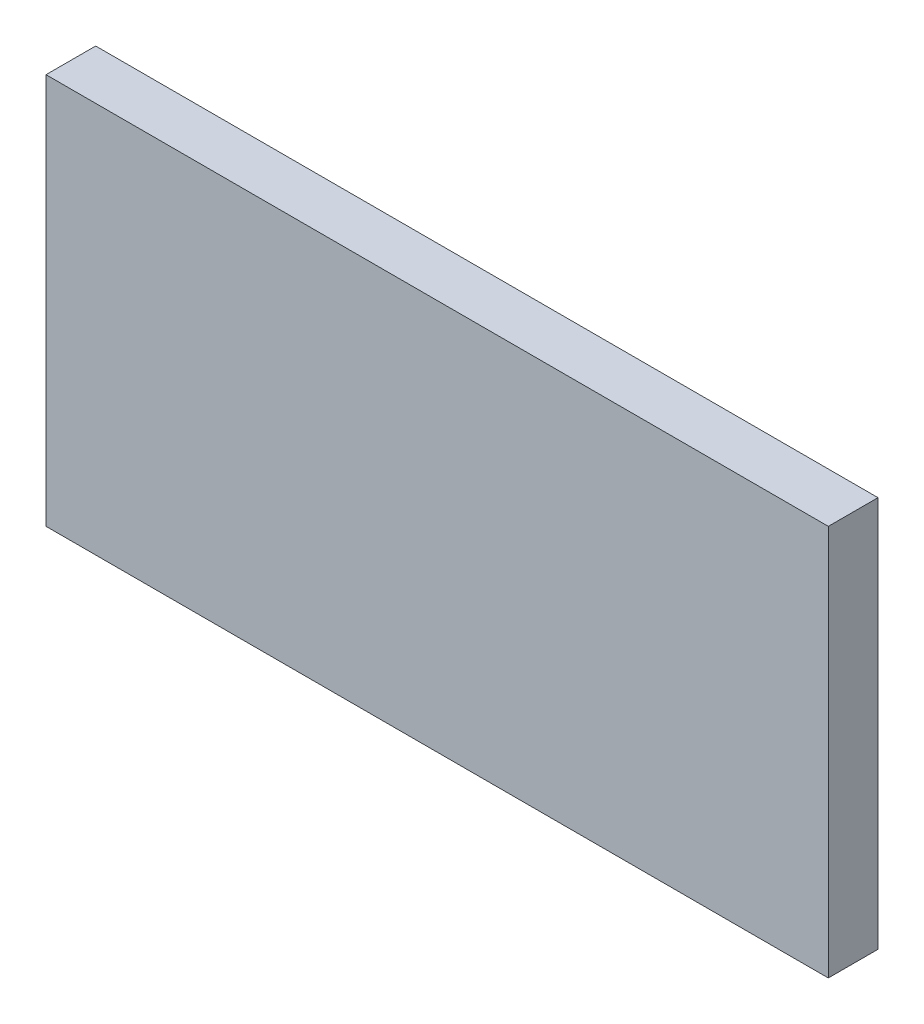
ISO-10303-21;
HEADER;
FILE_DESCRIPTION(('STEP AP214'),'2;1');
FILE_NAME('part.step','',(''),(''),'','','');
FILE_SCHEMA(('AUTOMOTIVE_DESIGN { 1 0 10303 214 1 1 1 1 }'));
ENDSEC;
DATA;
#1=APPLICATION_CONTEXT('core data for automotive mechanical design processes');
#2=APPLICATION_PROTOCOL_DEFINITION('international standard','automotive_design',2000,#1);
#3=PRODUCT_CONTEXT('',#1,'mechanical');
#4=PRODUCT('Part','Part','',(#3));
#5=PRODUCT_RELATED_PRODUCT_CATEGORY('part','',(#4));
#6=PRODUCT_DEFINITION_FORMATION('','',#4);
#7=PRODUCT_DEFINITION_CONTEXT('part definition',#1,'design');
#8=PRODUCT_DEFINITION('design','',#6,#7);
#9=PRODUCT_DEFINITION_SHAPE('','',#8);
#10=(LENGTH_UNIT() NAMED_UNIT(*) SI_UNIT(.MILLI.,.METRE.));
#11=(NAMED_UNIT(*) PLANE_ANGLE_UNIT() SI_UNIT($,.RADIAN.));
#12=(NAMED_UNIT(*) SI_UNIT($,.STERADIAN.) SOLID_ANGLE_UNIT());
#13=UNCERTAINTY_MEASURE_WITH_UNIT(LENGTH_MEASURE(1.E-05),#10,'distance_accuracy_value','');
#14=(GEOMETRIC_REPRESENTATION_CONTEXT(3) GLOBAL_UNCERTAINTY_ASSIGNED_CONTEXT((#13)) GLOBAL_UNIT_ASSIGNED_CONTEXT((#10,
#11,#12)) REPRESENTATION_CONTEXT('',''));
#15=CARTESIAN_POINT('',(0.,0.,0.));
#16=DIRECTION('',(0.,0.,1.));
#17=DIRECTION('',(1.,0.,0.));
#18=AXIS2_PLACEMENT_3D('',#15,#16,#17);
#19=CARTESIAN_POINT('',(0.,0.,3.175));
#20=DIRECTION('',(1.,0.,0.));
#21=DIRECTION('',(0.,0.,-1.));
#22=AXIS2_PLACEMENT_3D('',#19,#20,#21);
#23=PLANE('',#22);
#24=DIRECTION('',(0.,-1.,0.));
#25=VECTOR('',#24,1.);
#26=CARTESIAN_POINT('',(0.,0.,0.));
#27=LINE('',#26,#25);
#28=CARTESIAN_POINT('',(0.,25.,0.));
#29=VERTEX_POINT('',#28);
#30=CARTESIAN_POINT('',(0.,0.,0.));
#31=VERTEX_POINT('',#30);
#32=EDGE_CURVE('E96',#29,#31,#27,.T.);
#33=ORIENTED_EDGE('',*,*,#32,.T.);
#34=DIRECTION('',(0.,0.,-1.));
#35=VECTOR('',#34,1.);
#36=CARTESIAN_POINT('',(0.,0.,3.175));
#37=LINE('',#36,#35);
#38=CARTESIAN_POINT('',(0.,0.,3.175));
#39=VERTEX_POINT('',#38);
#40=EDGE_CURVE('E11',#39,#31,#37,.T.);
#41=ORIENTED_EDGE('',*,*,#40,.F.);
#42=DIRECTION('',(0.,-1.,0.));
#43=VECTOR('',#42,1.);
#44=CARTESIAN_POINT('',(0.,0.,3.175));
#45=LINE('',#44,#43);
#46=CARTESIAN_POINT('',(0.,25.,3.175));
#47=VERTEX_POINT('',#46);
#48=EDGE_CURVE('E84',#47,#39,#45,.T.);
#49=ORIENTED_EDGE('',*,*,#48,.F.);
#50=DIRECTION('',(0.,0.,-1.));
#51=VECTOR('',#50,1.);
#52=CARTESIAN_POINT('',(0.,25.,3.175));
#53=LINE('',#52,#51);
#54=EDGE_CURVE('E92',#47,#29,#53,.T.);
#55=ORIENTED_EDGE('',*,*,#54,.T.);
#56=EDGE_LOOP('',(#33,#41,#49,#55));
#57=FACE_BOUND('',#56,.T.);
#58=ADVANCED_FACE('F33',(#57),#23,.F.);
#59=CARTESIAN_POINT('',(0.,0.,3.175));
#60=DIRECTION('',(0.,1.,0.));
#61=DIRECTION('',(0.,0.,1.));
#62=AXIS2_PLACEMENT_3D('',#59,#60,#61);
#63=PLANE('',#62);
#64=DIRECTION('',(1.,0.,0.));
#65=VECTOR('',#64,1.);
#66=CARTESIAN_POINT('',(0.,0.,0.));
#67=LINE('',#66,#65);
#68=CARTESIAN_POINT('',(50.,0.,0.));
#69=VERTEX_POINT('',#68);
#70=EDGE_CURVE('E88',#31,#69,#67,.T.);
#71=ORIENTED_EDGE('',*,*,#70,.T.);
#72=DIRECTION('',(0.,0.,-1.));
#73=VECTOR('',#72,1.);
#74=CARTESIAN_POINT('',(50.,0.,3.175));
#75=LINE('',#74,#73);
#76=CARTESIAN_POINT('',(50.,0.,3.175));
#77=VERTEX_POINT('',#76);
#78=EDGE_CURVE('E41',#77,#69,#75,.T.);
#79=ORIENTED_EDGE('',*,*,#78,.F.);
#80=DIRECTION('',(1.,0.,0.));
#81=VECTOR('',#80,1.);
#82=CARTESIAN_POINT('',(0.,0.,3.175));
#83=LINE('',#82,#81);
#84=EDGE_CURVE('E79',#39,#77,#83,.T.);
#85=ORIENTED_EDGE('',*,*,#84,.F.);
#86=ORIENTED_EDGE('',*,*,#40,.T.);
#87=EDGE_LOOP('',(#71,#79,#85,#86));
#88=FACE_BOUND('',#87,.T.);
#89=ADVANCED_FACE('F87',(#88),#63,.F.);
#90=CARTESIAN_POINT('',(50.,0.,3.175));
#91=DIRECTION('',(-1.,0.,0.));
#92=DIRECTION('',(0.,0.,1.));
#93=AXIS2_PLACEMENT_3D('',#90,#91,#92);
#94=PLANE('',#93);
#95=DIRECTION('',(0.,1.,0.));
#96=VECTOR('',#95,1.);
#97=CARTESIAN_POINT('',(50.,0.,0.));
#98=LINE('',#97,#96);
#99=CARTESIAN_POINT('',(50.,25.,0.));
#100=VERTEX_POINT('',#99);
#101=EDGE_CURVE('E66',#69,#100,#98,.T.);
#102=ORIENTED_EDGE('',*,*,#101,.T.);
#103=DIRECTION('',(0.,0.,-1.));
#104=VECTOR('',#103,1.);
#105=CARTESIAN_POINT('',(50.,25.,3.175));
#106=LINE('',#105,#104);
#107=CARTESIAN_POINT('',(50.,25.,3.175));
#108=VERTEX_POINT('',#107);
#109=EDGE_CURVE('E89',#108,#100,#106,.T.);
#110=ORIENTED_EDGE('',*,*,#109,.F.);
#111=DIRECTION('',(0.,1.,0.));
#112=VECTOR('',#111,1.);
#113=CARTESIAN_POINT('',(50.,0.,3.175));
#114=LINE('',#113,#112);
#115=EDGE_CURVE('E82',#77,#108,#114,.T.);
#116=ORIENTED_EDGE('',*,*,#115,.F.);
#117=ORIENTED_EDGE('',*,*,#78,.T.);
#118=EDGE_LOOP('',(#102,#110,#116,#117));
#119=FACE_BOUND('',#118,.T.);
#120=ADVANCED_FACE('F90',(#119),#94,.F.);
#121=CARTESIAN_POINT('',(0.,25.,3.175));
#122=DIRECTION('',(0.,-1.,0.));
#123=DIRECTION('',(0.,0.,-1.));
#124=AXIS2_PLACEMENT_3D('',#121,#122,#123);
#125=PLANE('',#124);
#126=DIRECTION('',(-1.,0.,0.));
#127=VECTOR('',#126,1.);
#128=CARTESIAN_POINT('',(0.,25.,0.));
#129=LINE('',#128,#127);
#130=EDGE_CURVE('E72',#100,#29,#129,.T.);
#131=ORIENTED_EDGE('',*,*,#130,.T.);
#132=ORIENTED_EDGE('',*,*,#54,.F.);
#133=DIRECTION('',(-1.,0.,0.));
#134=VECTOR('',#133,1.);
#135=CARTESIAN_POINT('',(0.,25.,3.175));
#136=LINE('',#135,#134);
#137=EDGE_CURVE('E49',#108,#47,#136,.T.);
#138=ORIENTED_EDGE('',*,*,#137,.F.);
#139=ORIENTED_EDGE('',*,*,#109,.T.);
#140=EDGE_LOOP('',(#131,#132,#138,#139));
#141=FACE_BOUND('',#140,.T.);
#142=ADVANCED_FACE('F103',(#141),#125,.F.);
#143=CARTESIAN_POINT('',(0.,0.,3.175));
#144=DIRECTION('',(0.,0.,-1.));
#145=DIRECTION('',(-1.,0.,0.));
#146=AXIS2_PLACEMENT_3D('',#143,#144,#145);
#147=PLANE('',#146);
#148=ORIENTED_EDGE('',*,*,#48,.T.);
#149=ORIENTED_EDGE('',*,*,#84,.T.);
#150=ORIENTED_EDGE('',*,*,#115,.T.);
#151=ORIENTED_EDGE('',*,*,#137,.T.);
#152=EDGE_LOOP('',(#148,#149,#150,#151));
#153=FACE_BOUND('',#152,.T.);
#154=ADVANCED_FACE('F80',(#153),#147,.F.);
#155=CARTESIAN_POINT('',(0.,0.,0.));
#156=DIRECTION('',(0.,0.,-1.));
#157=DIRECTION('',(-1.,0.,0.));
#158=AXIS2_PLACEMENT_3D('',#155,#156,#157);
#159=PLANE('',#158);
#160=ORIENTED_EDGE('',*,*,#32,.F.);
#161=ORIENTED_EDGE('',*,*,#130,.F.);
#162=ORIENTED_EDGE('',*,*,#101,.F.);
#163=ORIENTED_EDGE('',*,*,#70,.F.);
#164=EDGE_LOOP('',(#160,#161,#162,#163));
#165=FACE_BOUND('',#164,.T.);
#166=ADVANCED_FACE('F106',(#165),#159,.T.);
#167=CLOSED_SHELL('',(#58,#89,#120,#142,#154,#166));
#168=MANIFOLD_SOLID_BREP('B2',#167);
#169=ADVANCED_BREP_SHAPE_REPRESENTATION('',(#18,#168),#14);
#170=SHAPE_DEFINITION_REPRESENTATION(#9,#169);
ENDSEC;
END-ISO-10303-21;
